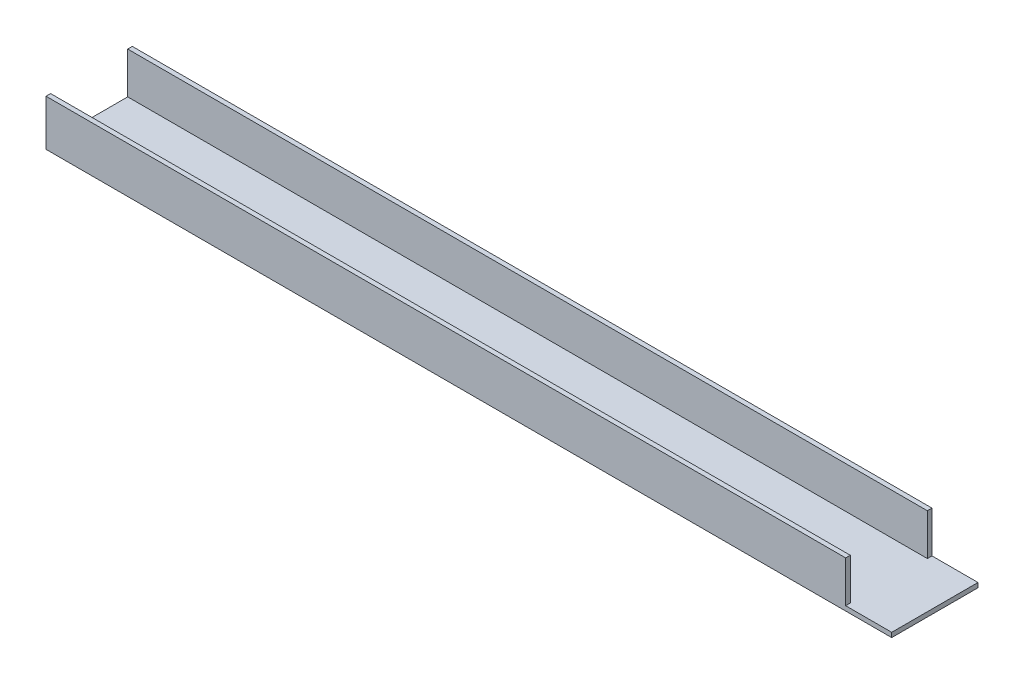
ISO-10303-21;
HEADER;
FILE_DESCRIPTION(('STEP AP214'),'2;1');
FILE_NAME('part.step','',(''),(''),'','','');
FILE_SCHEMA(('AUTOMOTIVE_DESIGN { 1 0 10303 214 1 1 1 1 }'));
ENDSEC;
DATA;
#1=APPLICATION_CONTEXT('core data for automotive mechanical design processes');
#2=APPLICATION_PROTOCOL_DEFINITION('international standard','automotive_design',2000,#1);
#3=PRODUCT_CONTEXT('',#1,'mechanical');
#4=PRODUCT('Part','Part','',(#3));
#5=PRODUCT_RELATED_PRODUCT_CATEGORY('part','',(#4));
#6=PRODUCT_DEFINITION_FORMATION('','',#4);
#7=PRODUCT_DEFINITION_CONTEXT('part definition',#1,'design');
#8=PRODUCT_DEFINITION('design','',#6,#7);
#9=PRODUCT_DEFINITION_SHAPE('','',#8);
#10=(LENGTH_UNIT() NAMED_UNIT(*) SI_UNIT(.MILLI.,.METRE.));
#11=(NAMED_UNIT(*) PLANE_ANGLE_UNIT() SI_UNIT($,.RADIAN.));
#12=(NAMED_UNIT(*) SI_UNIT($,.STERADIAN.) SOLID_ANGLE_UNIT());
#13=UNCERTAINTY_MEASURE_WITH_UNIT(LENGTH_MEASURE(1.E-05),#10,'distance_accuracy_value','');
#14=(GEOMETRIC_REPRESENTATION_CONTEXT(3) GLOBAL_UNCERTAINTY_ASSIGNED_CONTEXT((#13)) GLOBAL_UNIT_ASSIGNED_CONTEXT((#10,
#11,#12)) REPRESENTATION_CONTEXT('',''));
#15=CARTESIAN_POINT('',(0.,0.,0.));
#16=DIRECTION('',(0.,0.,1.));
#17=DIRECTION('',(1.,0.,0.));
#18=AXIS2_PLACEMENT_3D('',#15,#16,#17);
#19=CARTESIAN_POINT('',(0.,4.,0.));
#20=DIRECTION('',(0.,-1.,0.));
#21=DIRECTION('',(0.,0.,-1.));
#22=AXIS2_PLACEMENT_3D('',#19,#20,#21);
#23=PLANE('',#22);
#24=DIRECTION('',(0.,0.,-1.));
#25=VECTOR('',#24,1.);
#26=CARTESIAN_POINT('',(695.,4.,-75.));
#27=LINE('',#26,#25);
#28=CARTESIAN_POINT('',(695.,4.,-71.));
#29=VERTEX_POINT('',#28);
#30=CARTESIAN_POINT('',(695.,4.,-75.));
#31=VERTEX_POINT('',#30);
#32=EDGE_CURVE('E57',#29,#31,#27,.T.);
#33=ORIENTED_EDGE('',*,*,#32,.F.);
#34=DIRECTION('',(1.,0.,0.));
#35=VECTOR('',#34,1.);
#36=CARTESIAN_POINT('',(695.,4.,-71.));
#37=LINE('',#36,#35);
#38=CARTESIAN_POINT('',(0.,4.,-71.));
#39=VERTEX_POINT('',#38);
#40=EDGE_CURVE('E61',#39,#29,#37,.T.);
#41=ORIENTED_EDGE('',*,*,#40,.F.);
#42=DIRECTION('',(0.,0.,1.));
#43=VECTOR('',#42,1.);
#44=CARTESIAN_POINT('',(0.,4.,0.));
#45=LINE('',#44,#43);
#46=CARTESIAN_POINT('',(0.,4.,-4.));
#47=VERTEX_POINT('',#46);
#48=EDGE_CURVE('E170',#39,#47,#45,.T.);
#49=ORIENTED_EDGE('',*,*,#48,.T.);
#50=DIRECTION('',(-1.,0.,0.));
#51=VECTOR('',#50,1.);
#52=CARTESIAN_POINT('',(0.,4.,-4.));
#53=LINE('',#52,#51);
#54=CARTESIAN_POINT('',(695.,4.,-4.));
#55=VERTEX_POINT('',#54);
#56=EDGE_CURVE('E149',#55,#47,#53,.T.);
#57=ORIENTED_EDGE('',*,*,#56,.F.);
#58=DIRECTION('',(0.,0.,-1.));
#59=VECTOR('',#58,1.);
#60=CARTESIAN_POINT('',(695.,4.,0.));
#61=LINE('',#60,#59);
#62=CARTESIAN_POINT('',(695.,4.,0.));
#63=VERTEX_POINT('',#62);
#64=EDGE_CURVE('E156',#63,#55,#61,.T.);
#65=ORIENTED_EDGE('',*,*,#64,.F.);
#66=DIRECTION('',(1.,0.,0.));
#67=VECTOR('',#66,1.);
#68=CARTESIAN_POINT('',(0.,4.,0.));
#69=LINE('',#68,#67);
#70=CARTESIAN_POINT('',(735.,4.,0.));
#71=VERTEX_POINT('',#70);
#72=EDGE_CURVE('E172',#63,#71,#69,.T.);
#73=ORIENTED_EDGE('',*,*,#72,.T.);
#74=DIRECTION('',(0.,0.,-1.));
#75=VECTOR('',#74,1.);
#76=CARTESIAN_POINT('',(735.,4.,0.));
#77=LINE('',#76,#75);
#78=CARTESIAN_POINT('',(735.,4.,-75.));
#79=VERTEX_POINT('',#78);
#80=EDGE_CURVE('E175',#71,#79,#77,.T.);
#81=ORIENTED_EDGE('',*,*,#80,.T.);
#82=DIRECTION('',(-1.,0.,0.));
#83=VECTOR('',#82,1.);
#84=CARTESIAN_POINT('',(0.,4.,-75.));
#85=LINE('',#84,#83);
#86=EDGE_CURVE('E177',#79,#31,#85,.T.);
#87=ORIENTED_EDGE('',*,*,#86,.T.);
#88=EDGE_LOOP('',(#33,#41,#49,#57,#65,#73,#81,#87));
#89=FACE_BOUND('',#88,.T.);
#90=ADVANCED_FACE('F42',(#89),#23,.F.);
#91=CARTESIAN_POINT('',(0.,4.,0.));
#92=DIRECTION('',(1.,0.,0.));
#93=DIRECTION('',(0.,0.,-1.));
#94=AXIS2_PLACEMENT_3D('',#91,#92,#93);
#95=PLANE('',#94);
#96=DIRECTION('',(0.,0.,1.));
#97=VECTOR('',#96,1.);
#98=CARTESIAN_POINT('',(0.,0.,0.));
#99=LINE('',#98,#97);
#100=CARTESIAN_POINT('',(0.,0.,-75.));
#101=VERTEX_POINT('',#100);
#102=CARTESIAN_POINT('',(0.,0.,0.));
#103=VERTEX_POINT('',#102);
#104=EDGE_CURVE('E169',#101,#103,#99,.T.);
#105=ORIENTED_EDGE('',*,*,#104,.T.);
#106=DIRECTION('',(0.,-1.,0.));
#107=VECTOR('',#106,1.);
#108=CARTESIAN_POINT('',(0.,4.,0.));
#109=LINE('',#108,#107);
#110=CARTESIAN_POINT('',(0.,40.,0.));
#111=VERTEX_POINT('',#110);
#112=EDGE_CURVE('E11',#111,#103,#109,.T.);
#113=ORIENTED_EDGE('',*,*,#112,.F.);
#114=DIRECTION('',(0.,0.,1.));
#115=VECTOR('',#114,1.);
#116=CARTESIAN_POINT('',(0.,40.,0.));
#117=LINE('',#116,#115);
#118=CARTESIAN_POINT('',(0.,40.,-4.));
#119=VERTEX_POINT('',#118);
#120=EDGE_CURVE('E145',#119,#111,#117,.T.);
#121=ORIENTED_EDGE('',*,*,#120,.F.);
#122=DIRECTION('',(0.,-1.,0.));
#123=VECTOR('',#122,1.);
#124=CARTESIAN_POINT('',(0.,40.,-4.));
#125=LINE('',#124,#123);
#126=EDGE_CURVE('E155',#119,#47,#125,.T.);
#127=ORIENTED_EDGE('',*,*,#126,.T.);
#128=ORIENTED_EDGE('',*,*,#48,.F.);
#129=DIRECTION('',(0.,-1.,0.));
#130=VECTOR('',#129,1.);
#131=CARTESIAN_POINT('',(0.,40.,-71.));
#132=LINE('',#131,#130);
#133=CARTESIAN_POINT('',(0.,40.,-71.));
#134=VERTEX_POINT('',#133);
#135=EDGE_CURVE('E134',#134,#39,#132,.T.);
#136=ORIENTED_EDGE('',*,*,#135,.F.);
#137=DIRECTION('',(0.,0.,1.));
#138=VECTOR('',#137,1.);
#139=CARTESIAN_POINT('',(0.,40.,-75.));
#140=LINE('',#139,#138);
#141=CARTESIAN_POINT('',(0.,40.,-75.));
#142=VERTEX_POINT('',#141);
#143=EDGE_CURVE('E125',#142,#134,#140,.T.);
#144=ORIENTED_EDGE('',*,*,#143,.F.);
#145=DIRECTION('',(0.,-1.,0.));
#146=VECTOR('',#145,1.);
#147=CARTESIAN_POINT('',(0.,4.,-75.));
#148=LINE('',#147,#146);
#149=EDGE_CURVE('E179',#142,#101,#148,.T.);
#150=ORIENTED_EDGE('',*,*,#149,.T.);
#151=EDGE_LOOP('',(#105,#113,#121,#127,#128,#136,#144,#150));
#152=FACE_BOUND('',#151,.T.);
#153=ADVANCED_FACE('F44',(#152),#95,.F.);
#154=CARTESIAN_POINT('',(0.,4.,0.));
#155=DIRECTION('',(0.,0.,-1.));
#156=DIRECTION('',(-1.,0.,0.));
#157=AXIS2_PLACEMENT_3D('',#154,#155,#156);
#158=PLANE('',#157);
#159=DIRECTION('',(1.,0.,0.));
#160=VECTOR('',#159,1.);
#161=CARTESIAN_POINT('',(0.,0.,0.));
#162=LINE('',#161,#160);
#163=CARTESIAN_POINT('',(735.,0.,0.));
#164=VERTEX_POINT('',#163);
#165=EDGE_CURVE('E182',#103,#164,#162,.T.);
#166=ORIENTED_EDGE('',*,*,#165,.T.);
#167=DIRECTION('',(0.,-1.,0.));
#168=VECTOR('',#167,1.);
#169=CARTESIAN_POINT('',(735.,4.,0.));
#170=LINE('',#169,#168);
#171=EDGE_CURVE('E50',#71,#164,#170,.T.);
#172=ORIENTED_EDGE('',*,*,#171,.F.);
#173=ORIENTED_EDGE('',*,*,#72,.F.);
#174=DIRECTION('',(0.,-1.,0.));
#175=VECTOR('',#174,1.);
#176=CARTESIAN_POINT('',(695.,40.,0.));
#177=LINE('',#176,#175);
#178=CARTESIAN_POINT('',(695.,40.,0.));
#179=VERTEX_POINT('',#178);
#180=EDGE_CURVE('E166',#179,#63,#177,.T.);
#181=ORIENTED_EDGE('',*,*,#180,.F.);
#182=DIRECTION('',(1.,0.,0.));
#183=VECTOR('',#182,1.);
#184=CARTESIAN_POINT('',(0.,40.,0.));
#185=LINE('',#184,#183);
#186=EDGE_CURVE('E148',#111,#179,#185,.T.);
#187=ORIENTED_EDGE('',*,*,#186,.F.);
#188=ORIENTED_EDGE('',*,*,#112,.T.);
#189=EDGE_LOOP('',(#166,#172,#173,#181,#187,#188));
#190=FACE_BOUND('',#189,.T.);
#191=ADVANCED_FACE('F212',(#190),#158,.F.);
#192=CARTESIAN_POINT('',(735.,4.,0.));
#193=DIRECTION('',(-1.,0.,0.));
#194=DIRECTION('',(0.,0.,1.));
#195=AXIS2_PLACEMENT_3D('',#192,#193,#194);
#196=PLANE('',#195);
#197=DIRECTION('',(0.,0.,-1.));
#198=VECTOR('',#197,1.);
#199=CARTESIAN_POINT('',(735.,0.,0.));
#200=LINE('',#199,#198);
#201=CARTESIAN_POINT('',(735.,0.,-75.));
#202=VERTEX_POINT('',#201);
#203=EDGE_CURVE('E184',#164,#202,#200,.T.);
#204=ORIENTED_EDGE('',*,*,#203,.T.);
#205=DIRECTION('',(0.,-1.,0.));
#206=VECTOR('',#205,1.);
#207=CARTESIAN_POINT('',(735.,4.,-75.));
#208=LINE('',#207,#206);
#209=EDGE_CURVE('E189',#79,#202,#208,.T.);
#210=ORIENTED_EDGE('',*,*,#209,.F.);
#211=ORIENTED_EDGE('',*,*,#80,.F.);
#212=ORIENTED_EDGE('',*,*,#171,.T.);
#213=EDGE_LOOP('',(#204,#210,#211,#212));
#214=FACE_BOUND('',#213,.T.);
#215=ADVANCED_FACE('F196',(#214),#196,.F.);
#216=CARTESIAN_POINT('',(0.,4.,-75.));
#217=DIRECTION('',(0.,0.,1.));
#218=DIRECTION('',(1.,0.,0.));
#219=AXIS2_PLACEMENT_3D('',#216,#217,#218);
#220=PLANE('',#219);
#221=DIRECTION('',(-1.,0.,0.));
#222=VECTOR('',#221,1.);
#223=CARTESIAN_POINT('',(0.,0.,-75.));
#224=LINE('',#223,#222);
#225=EDGE_CURVE('E173',#202,#101,#224,.T.);
#226=ORIENTED_EDGE('',*,*,#225,.T.);
#227=ORIENTED_EDGE('',*,*,#149,.F.);
#228=DIRECTION('',(-1.,0.,0.));
#229=VECTOR('',#228,1.);
#230=CARTESIAN_POINT('',(695.,40.,-75.));
#231=LINE('',#230,#229);
#232=CARTESIAN_POINT('',(695.,40.,-75.));
#233=VERTEX_POINT('',#232);
#234=EDGE_CURVE('E139',#233,#142,#231,.T.);
#235=ORIENTED_EDGE('',*,*,#234,.F.);
#236=DIRECTION('',(0.,-1.,0.));
#237=VECTOR('',#236,1.);
#238=CARTESIAN_POINT('',(695.,40.,-75.));
#239=LINE('',#238,#237);
#240=EDGE_CURVE('E138',#233,#31,#239,.T.);
#241=ORIENTED_EDGE('',*,*,#240,.T.);
#242=ORIENTED_EDGE('',*,*,#86,.F.);
#243=ORIENTED_EDGE('',*,*,#209,.T.);
#244=EDGE_LOOP('',(#226,#227,#235,#241,#242,#243));
#245=FACE_BOUND('',#244,.T.);
#246=ADVANCED_FACE('F205',(#245),#220,.F.);
#247=CARTESIAN_POINT('',(0.,0.,0.));
#248=DIRECTION('',(0.,-1.,0.));
#249=DIRECTION('',(0.,0.,-1.));
#250=AXIS2_PLACEMENT_3D('',#247,#248,#249);
#251=PLANE('',#250);
#252=ORIENTED_EDGE('',*,*,#104,.F.);
#253=ORIENTED_EDGE('',*,*,#225,.F.);
#254=ORIENTED_EDGE('',*,*,#203,.F.);
#255=ORIENTED_EDGE('',*,*,#165,.F.);
#256=EDGE_LOOP('',(#252,#253,#254,#255));
#257=FACE_BOUND('',#256,.T.);
#258=ADVANCED_FACE('F203',(#257),#251,.T.);
#259=CARTESIAN_POINT('',(695.,40.,0.));
#260=DIRECTION('',(-1.,0.,0.));
#261=DIRECTION('',(0.,0.,1.));
#262=AXIS2_PLACEMENT_3D('',#259,#260,#261);
#263=PLANE('',#262);
#264=ORIENTED_EDGE('',*,*,#64,.T.);
#265=DIRECTION('',(0.,-1.,0.));
#266=VECTOR('',#265,1.);
#267=CARTESIAN_POINT('',(695.,40.,-4.));
#268=LINE('',#267,#266);
#269=CARTESIAN_POINT('',(695.,40.,-4.));
#270=VERTEX_POINT('',#269);
#271=EDGE_CURVE('E163',#270,#55,#268,.T.);
#272=ORIENTED_EDGE('',*,*,#271,.F.);
#273=DIRECTION('',(0.,0.,-1.));
#274=VECTOR('',#273,1.);
#275=CARTESIAN_POINT('',(695.,40.,0.));
#276=LINE('',#275,#274);
#277=EDGE_CURVE('E151',#179,#270,#276,.T.);
#278=ORIENTED_EDGE('',*,*,#277,.F.);
#279=ORIENTED_EDGE('',*,*,#180,.T.);
#280=EDGE_LOOP('',(#264,#272,#278,#279));
#281=FACE_BOUND('',#280,.T.);
#282=ADVANCED_FACE('F216',(#281),#263,.F.);
#283=CARTESIAN_POINT('',(0.,40.,-4.));
#284=DIRECTION('',(0.,0.,1.));
#285=DIRECTION('',(1.,0.,0.));
#286=AXIS2_PLACEMENT_3D('',#283,#284,#285);
#287=PLANE('',#286);
#288=ORIENTED_EDGE('',*,*,#56,.T.);
#289=ORIENTED_EDGE('',*,*,#126,.F.);
#290=DIRECTION('',(-1.,0.,0.));
#291=VECTOR('',#290,1.);
#292=CARTESIAN_POINT('',(0.,40.,-4.));
#293=LINE('',#292,#291);
#294=EDGE_CURVE('E153',#270,#119,#293,.T.);
#295=ORIENTED_EDGE('',*,*,#294,.F.);
#296=ORIENTED_EDGE('',*,*,#271,.T.);
#297=EDGE_LOOP('',(#288,#289,#295,#296));
#298=FACE_BOUND('',#297,.T.);
#299=ADVANCED_FACE('F224',(#298),#287,.F.);
#300=CARTESIAN_POINT('',(0.,40.,0.));
#301=DIRECTION('',(0.,-1.,0.));
#302=DIRECTION('',(0.,0.,-1.));
#303=AXIS2_PLACEMENT_3D('',#300,#301,#302);
#304=PLANE('',#303);
#305=ORIENTED_EDGE('',*,*,#120,.T.);
#306=ORIENTED_EDGE('',*,*,#186,.T.);
#307=ORIENTED_EDGE('',*,*,#277,.T.);
#308=ORIENTED_EDGE('',*,*,#294,.T.);
#309=EDGE_LOOP('',(#305,#306,#307,#308));
#310=FACE_BOUND('',#309,.T.);
#311=ADVANCED_FACE('F220',(#310),#304,.F.);
#312=CARTESIAN_POINT('',(695.,40.,-75.));
#313=DIRECTION('',(-1.,0.,0.));
#314=DIRECTION('',(0.,0.,1.));
#315=AXIS2_PLACEMENT_3D('',#312,#313,#314);
#316=PLANE('',#315);
#317=ORIENTED_EDGE('',*,*,#32,.T.);
#318=ORIENTED_EDGE('',*,*,#240,.F.);
#319=DIRECTION('',(0.,0.,-1.));
#320=VECTOR('',#319,1.);
#321=CARTESIAN_POINT('',(695.,40.,-75.));
#322=LINE('',#321,#320);
#323=CARTESIAN_POINT('',(695.,40.,-71.));
#324=VERTEX_POINT('',#323);
#325=EDGE_CURVE('E122',#324,#233,#322,.T.);
#326=ORIENTED_EDGE('',*,*,#325,.F.);
#327=DIRECTION('',(0.,-1.,0.));
#328=VECTOR('',#327,1.);
#329=CARTESIAN_POINT('',(695.,40.,-71.));
#330=LINE('',#329,#328);
#331=EDGE_CURVE('E129',#324,#29,#330,.T.);
#332=ORIENTED_EDGE('',*,*,#331,.T.);
#333=EDGE_LOOP('',(#317,#318,#326,#332));
#334=FACE_BOUND('',#333,.T.);
#335=ADVANCED_FACE('F136',(#334),#316,.F.);
#336=CARTESIAN_POINT('',(695.,40.,-71.));
#337=DIRECTION('',(0.,0.,-1.));
#338=DIRECTION('',(-1.,0.,0.));
#339=AXIS2_PLACEMENT_3D('',#336,#337,#338);
#340=PLANE('',#339);
#341=ORIENTED_EDGE('',*,*,#40,.T.);
#342=ORIENTED_EDGE('',*,*,#331,.F.);
#343=DIRECTION('',(1.,0.,0.));
#344=VECTOR('',#343,1.);
#345=CARTESIAN_POINT('',(695.,40.,-71.));
#346=LINE('',#345,#344);
#347=EDGE_CURVE('E117',#134,#324,#346,.T.);
#348=ORIENTED_EDGE('',*,*,#347,.F.);
#349=ORIENTED_EDGE('',*,*,#135,.T.);
#350=EDGE_LOOP('',(#341,#342,#348,#349));
#351=FACE_BOUND('',#350,.T.);
#352=ADVANCED_FACE('F132',(#351),#340,.F.);
#353=CARTESIAN_POINT('',(0.,40.,0.));
#354=DIRECTION('',(0.,-1.,0.));
#355=DIRECTION('',(0.,0.,-1.));
#356=AXIS2_PLACEMENT_3D('',#353,#354,#355);
#357=PLANE('',#356);
#358=ORIENTED_EDGE('',*,*,#325,.T.);
#359=ORIENTED_EDGE('',*,*,#234,.T.);
#360=ORIENTED_EDGE('',*,*,#143,.T.);
#361=ORIENTED_EDGE('',*,*,#347,.T.);
#362=EDGE_LOOP('',(#358,#359,#360,#361));
#363=FACE_BOUND('',#362,.T.);
#364=ADVANCED_FACE('F119',(#363),#357,.F.);
#365=CLOSED_SHELL('',(#90,#153,#191,#215,#246,#258,#282,#299,#311,#335,#352,#364));
#366=MANIFOLD_SOLID_BREP('B2',#365);
#367=ADVANCED_BREP_SHAPE_REPRESENTATION('',(#18,#366),#14);
#368=SHAPE_DEFINITION_REPRESENTATION(#9,#367);
ENDSEC;
END-ISO-10303-21;
